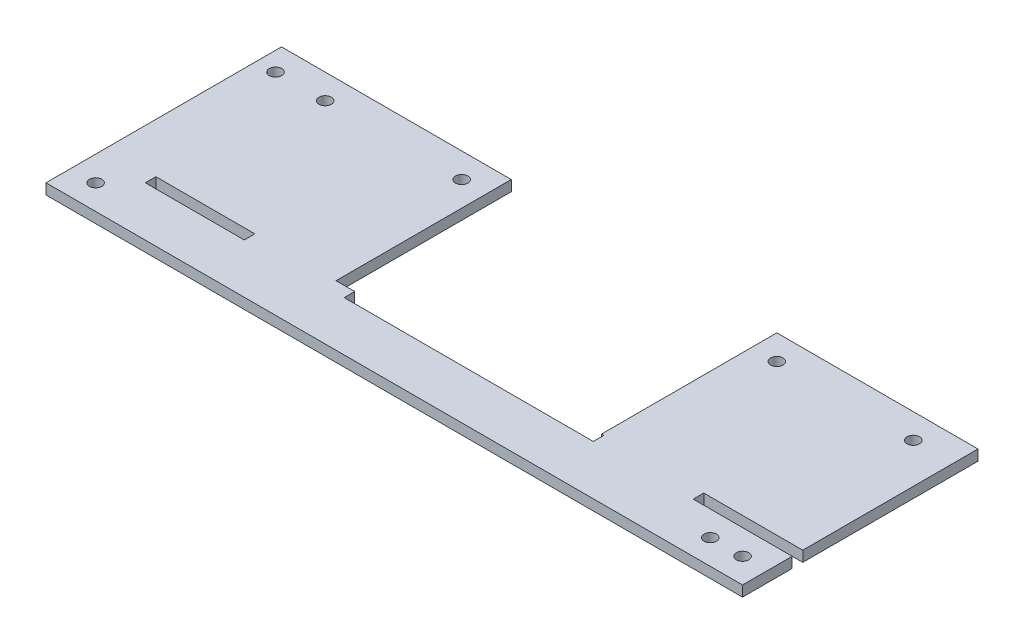
ISO-10303-21;
HEADER;
FILE_DESCRIPTION(('STEP AP214'),'2;1');
FILE_NAME('part.step','',(''),(''),'','','');
FILE_SCHEMA(('AUTOMOTIVE_DESIGN { 1 0 10303 214 1 1 1 1 }'));
ENDSEC;
DATA;
#1=APPLICATION_CONTEXT('core data for automotive mechanical design processes');
#2=APPLICATION_PROTOCOL_DEFINITION('international standard','automotive_design',2000,#1);
#3=PRODUCT_CONTEXT('',#1,'mechanical');
#4=PRODUCT('Part','Part','',(#3));
#5=PRODUCT_RELATED_PRODUCT_CATEGORY('part','',(#4));
#6=PRODUCT_DEFINITION_FORMATION('','',#4);
#7=PRODUCT_DEFINITION_CONTEXT('part definition',#1,'design');
#8=PRODUCT_DEFINITION('design','',#6,#7);
#9=PRODUCT_DEFINITION_SHAPE('','',#8);
#10=(LENGTH_UNIT() NAMED_UNIT(*) SI_UNIT(.MILLI.,.METRE.));
#11=(NAMED_UNIT(*) PLANE_ANGLE_UNIT() SI_UNIT($,.RADIAN.));
#12=(NAMED_UNIT(*) SI_UNIT($,.STERADIAN.) SOLID_ANGLE_UNIT());
#13=UNCERTAINTY_MEASURE_WITH_UNIT(LENGTH_MEASURE(1.E-05),#10,'distance_accuracy_value','');
#14=(GEOMETRIC_REPRESENTATION_CONTEXT(3) GLOBAL_UNCERTAINTY_ASSIGNED_CONTEXT((#13)) GLOBAL_UNIT_ASSIGNED_CONTEXT((#10,
#11,#12)) REPRESENTATION_CONTEXT('',''));
#15=CARTESIAN_POINT('',(0.,0.,0.));
#16=DIRECTION('',(0.,0.,1.));
#17=DIRECTION('',(1.,0.,0.));
#18=AXIS2_PLACEMENT_3D('',#15,#16,#17);
#19=CARTESIAN_POINT('',(75.2475,5.4102,-34.8361));
#20=DIRECTION('',(0.,-1.,0.));
#21=DIRECTION('',(0.,0.,-1.));
#22=AXIS2_PLACEMENT_3D('',#19,#20,#21);
#23=CYLINDRICAL_SURFACE('',#22,3.175);
#24=CARTESIAN_POINT('',(75.2475,5.4102,-34.8361));
#25=DIRECTION('',(0.,1.,0.));
#26=DIRECTION('',(0.,0.,1.));
#27=AXIS2_PLACEMENT_3D('',#24,#25,#26);
#28=CIRCLE('',#27,3.175);
#29=CARTESIAN_POINT('',(75.2475,5.4102,-31.6611));
#30=VERTEX_POINT('',#29);
#31=EDGE_CURVE('E265',#30,#30,#28,.T.);
#32=ORIENTED_EDGE('',*,*,#31,.T.);
#33=EDGE_LOOP('',(#32));
#34=FACE_BOUND('',#33,.T.);
#35=CARTESIAN_POINT('',(75.2475,0.,-34.8361));
#36=DIRECTION('',(0.,1.,0.));
#37=DIRECTION('',(0.,0.,1.));
#38=AXIS2_PLACEMENT_3D('',#35,#36,#37);
#39=CIRCLE('',#38,3.175);
#40=CARTESIAN_POINT('',(75.2475,0.,-31.6611));
#41=VERTEX_POINT('',#40);
#42=EDGE_CURVE('E300',#41,#41,#39,.T.);
#43=ORIENTED_EDGE('',*,*,#42,.F.);
#44=EDGE_LOOP('',(#43));
#45=FACE_BOUND('',#44,.T.);
#46=ADVANCED_FACE('F94',(#34,#45),#23,.F.);
#47=CARTESIAN_POINT('',(145.06956,5.4102,-34.8361));
#48=DIRECTION('',(0.,-1.,0.));
#49=DIRECTION('',(0.,0.,-1.));
#50=AXIS2_PLACEMENT_3D('',#47,#48,#49);
#51=CYLINDRICAL_SURFACE('',#50,3.17499999999997);
#52=CARTESIAN_POINT('',(145.06956,5.4102,-34.8361));
#53=DIRECTION('',(0.,1.,0.));
#54=DIRECTION('',(0.,0.,1.));
#55=AXIS2_PLACEMENT_3D('',#52,#53,#54);
#56=CIRCLE('',#55,3.17499999999997);
#57=CARTESIAN_POINT('',(145.06956,5.4102,-31.6611));
#58=VERTEX_POINT('',#57);
#59=EDGE_CURVE('E378',#58,#58,#56,.T.);
#60=ORIENTED_EDGE('',*,*,#59,.T.);
#61=EDGE_LOOP('',(#60));
#62=FACE_BOUND('',#61,.T.);
#63=CARTESIAN_POINT('',(145.06956,0.,-34.8361));
#64=DIRECTION('',(0.,1.,0.));
#65=DIRECTION('',(0.,0.,1.));
#66=AXIS2_PLACEMENT_3D('',#63,#64,#65);
#67=CIRCLE('',#66,3.17499999999997);
#68=CARTESIAN_POINT('',(145.06956,0.,-31.6611));
#69=VERTEX_POINT('',#68);
#70=EDGE_CURVE('E304',#69,#69,#67,.T.);
#71=ORIENTED_EDGE('',*,*,#70,.F.);
#72=EDGE_LOOP('',(#71));
#73=FACE_BOUND('',#72,.T.);
#74=ADVANCED_FACE('F474',(#62,#73),#51,.F.);
#75=CARTESIAN_POINT('',(-181.229,5.4102,-34.8361));
#76=DIRECTION('',(0.,-1.,0.));
#77=DIRECTION('',(0.,0.,-1.));
#78=AXIS2_PLACEMENT_3D('',#75,#76,#77);
#79=CYLINDRICAL_SURFACE('',#78,3.175);
#80=CARTESIAN_POINT('',(-181.229,5.4102,-34.8361));
#81=DIRECTION('',(0.,1.,0.));
#82=DIRECTION('',(0.,0.,1.));
#83=AXIS2_PLACEMENT_3D('',#80,#81,#82);
#84=CIRCLE('',#83,3.175);
#85=CARTESIAN_POINT('',(-181.229,5.4102,-31.6611));
#86=VERTEX_POINT('',#85);
#87=EDGE_CURVE('E381',#86,#86,#84,.T.);
#88=ORIENTED_EDGE('',*,*,#87,.T.);
#89=EDGE_LOOP('',(#88));
#90=FACE_BOUND('',#89,.T.);
#91=CARTESIAN_POINT('',(-181.229,0.,-34.8361));
#92=DIRECTION('',(0.,1.,0.));
#93=DIRECTION('',(0.,0.,1.));
#94=AXIS2_PLACEMENT_3D('',#91,#92,#93);
#95=CIRCLE('',#94,3.175);
#96=CARTESIAN_POINT('',(-181.229,0.,-31.6611));
#97=VERTEX_POINT('',#96);
#98=EDGE_CURVE('E307',#97,#97,#95,.T.);
#99=ORIENTED_EDGE('',*,*,#98,.F.);
#100=EDGE_LOOP('',(#99));
#101=FACE_BOUND('',#100,.T.);
#102=ADVANCED_FACE('F480',(#90,#101),#79,.F.);
#103=CARTESIAN_POINT('',(-178.181,5.4102,60.2361));
#104=DIRECTION('',(0.,-1.,0.));
#105=DIRECTION('',(0.,0.,-1.));
#106=AXIS2_PLACEMENT_3D('',#103,#104,#105);
#107=CYLINDRICAL_SURFACE('',#106,3.175);
#108=CARTESIAN_POINT('',(-178.181,5.4102,60.2361));
#109=DIRECTION('',(0.,1.,0.));
#110=DIRECTION('',(0.,0.,1.));
#111=AXIS2_PLACEMENT_3D('',#108,#109,#110);
#112=CIRCLE('',#111,3.175);
#113=CARTESIAN_POINT('',(-178.181,5.4102,63.4111));
#114=VERTEX_POINT('',#113);
#115=EDGE_CURVE('E384',#114,#114,#112,.T.);
#116=ORIENTED_EDGE('',*,*,#115,.T.);
#117=EDGE_LOOP('',(#116));
#118=FACE_BOUND('',#117,.T.);
#119=CARTESIAN_POINT('',(-178.181,0.,60.2361));
#120=DIRECTION('',(0.,1.,0.));
#121=DIRECTION('',(0.,0.,1.));
#122=AXIS2_PLACEMENT_3D('',#119,#120,#121);
#123=CIRCLE('',#122,3.175);
#124=CARTESIAN_POINT('',(-178.181,0.,63.4111));
#125=VERTEX_POINT('',#124);
#126=EDGE_CURVE('E310',#125,#125,#123,.T.);
#127=ORIENTED_EDGE('',*,*,#126,.F.);
#128=EDGE_LOOP('',(#127));
#129=FACE_BOUND('',#128,.T.);
#130=ADVANCED_FACE('F489',(#118,#129),#107,.F.);
#131=CARTESIAN_POINT('',(152.781,5.4102,60.2361));
#132=DIRECTION('',(0.,-1.,0.));
#133=DIRECTION('',(0.,0.,-1.));
#134=AXIS2_PLACEMENT_3D('',#131,#132,#133);
#135=CYLINDRICAL_SURFACE('',#134,3.175);
#136=CARTESIAN_POINT('',(152.781,5.4102,60.2361));
#137=DIRECTION('',(0.,1.,0.));
#138=DIRECTION('',(0.,0.,1.));
#139=AXIS2_PLACEMENT_3D('',#136,#137,#138);
#140=CIRCLE('',#139,3.175);
#141=CARTESIAN_POINT('',(152.781,5.4102,63.4111));
#142=VERTEX_POINT('',#141);
#143=EDGE_CURVE('E387',#142,#142,#140,.T.);
#144=ORIENTED_EDGE('',*,*,#143,.T.);
#145=EDGE_LOOP('',(#144));
#146=FACE_BOUND('',#145,.T.);
#147=CARTESIAN_POINT('',(152.781,0.,60.2361));
#148=DIRECTION('',(0.,1.,0.));
#149=DIRECTION('',(0.,0.,1.));
#150=AXIS2_PLACEMENT_3D('',#147,#148,#149);
#151=CIRCLE('',#150,3.175);
#152=CARTESIAN_POINT('',(152.781,0.,63.4111));
#153=VERTEX_POINT('',#152);
#154=EDGE_CURVE('E313',#153,#153,#151,.T.);
#155=ORIENTED_EDGE('',*,*,#154,.F.);
#156=EDGE_LOOP('',(#155));
#157=FACE_BOUND('',#156,.T.);
#158=ADVANCED_FACE('F493',(#146,#157),#135,.F.);
#159=CARTESIAN_POINT('',(136.271,5.4102,60.2361));
#160=DIRECTION('',(0.,-1.,0.));
#161=DIRECTION('',(0.,0.,-1.));
#162=AXIS2_PLACEMENT_3D('',#159,#160,#161);
#163=CYLINDRICAL_SURFACE('',#162,3.175);
#164=CARTESIAN_POINT('',(136.271,5.4102,60.2361));
#165=DIRECTION('',(0.,1.,0.));
#166=DIRECTION('',(0.,0.,1.));
#167=AXIS2_PLACEMENT_3D('',#164,#165,#166);
#168=CIRCLE('',#167,3.175);
#169=CARTESIAN_POINT('',(136.271,5.4102,63.4111));
#170=VERTEX_POINT('',#169);
#171=EDGE_CURVE('E390',#170,#170,#168,.T.);
#172=ORIENTED_EDGE('',*,*,#171,.T.);
#173=EDGE_LOOP('',(#172));
#174=FACE_BOUND('',#173,.T.);
#175=CARTESIAN_POINT('',(136.271,0.,60.2361));
#176=DIRECTION('',(0.,1.,0.));
#177=DIRECTION('',(0.,0.,1.));
#178=AXIS2_PLACEMENT_3D('',#175,#176,#177);
#179=CIRCLE('',#178,3.175);
#180=CARTESIAN_POINT('',(136.271,0.,63.4111));
#181=VERTEX_POINT('',#180);
#182=EDGE_CURVE('E316',#181,#181,#179,.T.);
#183=ORIENTED_EDGE('',*,*,#182,.F.);
#184=EDGE_LOOP('',(#183));
#185=FACE_BOUND('',#184,.T.);
#186=ADVANCED_FACE('F497',(#174,#185),#163,.F.);
#187=CARTESIAN_POINT('',(-155.829,5.4102,-34.8361));
#188=DIRECTION('',(0.,-1.,0.));
#189=DIRECTION('',(0.,0.,-1.));
#190=AXIS2_PLACEMENT_3D('',#187,#188,#189);
#191=CYLINDRICAL_SURFACE('',#190,3.175);
#192=CARTESIAN_POINT('',(-155.829,5.4102,-34.8361));
#193=DIRECTION('',(0.,1.,0.));
#194=DIRECTION('',(0.,0.,1.));
#195=AXIS2_PLACEMENT_3D('',#192,#193,#194);
#196=CIRCLE('',#195,3.175);
#197=CARTESIAN_POINT('',(-155.829,5.4102,-31.6611));
#198=VERTEX_POINT('',#197);
#199=EDGE_CURVE('E393',#198,#198,#196,.T.);
#200=ORIENTED_EDGE('',*,*,#199,.T.);
#201=EDGE_LOOP('',(#200));
#202=FACE_BOUND('',#201,.T.);
#203=CARTESIAN_POINT('',(-155.829,0.,-34.8361));
#204=DIRECTION('',(0.,1.,0.));
#205=DIRECTION('',(0.,0.,1.));
#206=AXIS2_PLACEMENT_3D('',#203,#204,#205);
#207=CIRCLE('',#206,3.175);
#208=CARTESIAN_POINT('',(-155.829,0.,-31.6611));
#209=VERTEX_POINT('',#208);
#210=EDGE_CURVE('E319',#209,#209,#207,.T.);
#211=ORIENTED_EDGE('',*,*,#210,.F.);
#212=EDGE_LOOP('',(#211));
#213=FACE_BOUND('',#212,.T.);
#214=ADVANCED_FACE('F501',(#202,#213),#191,.F.);
#215=CARTESIAN_POINT('',(-86.0069399999999,5.4102,-34.8361));
#216=DIRECTION('',(0.,-1.,0.));
#217=DIRECTION('',(0.,0.,-1.));
#218=AXIS2_PLACEMENT_3D('',#215,#216,#217);
#219=CYLINDRICAL_SURFACE('',#218,3.175);
#220=CARTESIAN_POINT('',(-86.0069399999999,5.4102,-34.8361));
#221=DIRECTION('',(0.,1.,0.));
#222=DIRECTION('',(0.,0.,1.));
#223=AXIS2_PLACEMENT_3D('',#220,#221,#222);
#224=CIRCLE('',#223,3.175);
#225=CARTESIAN_POINT('',(-86.0069399999999,5.4102,-31.6611));
#226=VERTEX_POINT('',#225);
#227=EDGE_CURVE('E396',#226,#226,#224,.T.);
#228=ORIENTED_EDGE('',*,*,#227,.T.);
#229=EDGE_LOOP('',(#228));
#230=FACE_BOUND('',#229,.T.);
#231=CARTESIAN_POINT('',(-86.0069399999999,0.,-34.8361));
#232=DIRECTION('',(0.,1.,0.));
#233=DIRECTION('',(0.,0.,1.));
#234=AXIS2_PLACEMENT_3D('',#231,#232,#233);
#235=CIRCLE('',#234,3.175);
#236=CARTESIAN_POINT('',(-86.0069399999999,0.,-31.6611));
#237=VERTEX_POINT('',#236);
#238=EDGE_CURVE('E322',#237,#237,#235,.T.);
#239=ORIENTED_EDGE('',*,*,#238,.F.);
#240=EDGE_LOOP('',(#239));
#241=FACE_BOUND('',#240,.T.);
#242=ADVANCED_FACE('F504',(#230,#241),#219,.F.);
#243=CARTESIAN_POINT('',(-165.481,5.4102,0.));
#244=DIRECTION('',(-1.,0.,0.));
#245=DIRECTION('',(0.,0.,1.));
#246=AXIS2_PLACEMENT_3D('',#243,#244,#245);
#247=PLANE('',#246);
#248=DIRECTION('',(0.,0.,-1.));
#249=VECTOR('',#248,1.);
#250=CARTESIAN_POINT('',(-165.481,0.,0.));
#251=LINE('',#250,#249);
#252=CARTESIAN_POINT('',(-165.481,0.,47.5361));
#253=VERTEX_POINT('',#252);
#254=CARTESIAN_POINT('',(-165.481,0.,42.1259));
#255=VERTEX_POINT('',#254);
#256=EDGE_CURVE('E257',#253,#255,#251,.T.);
#257=ORIENTED_EDGE('',*,*,#256,.T.);
#258=DIRECTION('',(0.,-1.,0.));
#259=VECTOR('',#258,1.);
#260=CARTESIAN_POINT('',(-165.481,5.4102,42.1259));
#261=LINE('',#260,#259);
#262=CARTESIAN_POINT('',(-165.481,5.4102,42.1259));
#263=VERTEX_POINT('',#262);
#264=EDGE_CURVE('E104',#263,#255,#261,.T.);
#265=ORIENTED_EDGE('',*,*,#264,.F.);
#266=DIRECTION('',(0.,0.,-1.));
#267=VECTOR('',#266,1.);
#268=CARTESIAN_POINT('',(-165.481,5.4102,0.));
#269=LINE('',#268,#267);
#270=CARTESIAN_POINT('',(-165.481,5.4102,47.5361));
#271=VERTEX_POINT('',#270);
#272=EDGE_CURVE('E246',#271,#263,#269,.T.);
#273=ORIENTED_EDGE('',*,*,#272,.F.);
#274=DIRECTION('',(0.,-1.,0.));
#275=VECTOR('',#274,1.);
#276=CARTESIAN_POINT('',(-165.481,5.4102,47.5361));
#277=LINE('',#276,#275);
#278=EDGE_CURVE('E12',#271,#253,#277,.T.);
#279=ORIENTED_EDGE('',*,*,#278,.T.);
#280=EDGE_LOOP('',(#257,#265,#273,#279));
#281=FACE_BOUND('',#280,.T.);
#282=ADVANCED_FACE('F255',(#281),#247,.F.);
#283=CARTESIAN_POINT('',(0.,5.4102,42.1259));
#284=DIRECTION('',(0.,0.,-1.));
#285=DIRECTION('',(-1.,0.,0.));
#286=AXIS2_PLACEMENT_3D('',#283,#284,#285);
#287=PLANE('',#286);
#288=DIRECTION('',(1.,0.,0.));
#289=VECTOR('',#288,1.);
#290=CARTESIAN_POINT('',(0.,0.,42.1259));
#291=LINE('',#290,#289);
#292=CARTESIAN_POINT('',(-114.8334,0.,42.1259));
#293=VERTEX_POINT('',#292);
#294=EDGE_CURVE('E328',#255,#293,#291,.T.);
#295=ORIENTED_EDGE('',*,*,#294,.T.);
#296=DIRECTION('',(0.,-1.,0.));
#297=VECTOR('',#296,1.);
#298=CARTESIAN_POINT('',(-114.8334,5.4102,42.1259));
#299=LINE('',#298,#297);
#300=CARTESIAN_POINT('',(-114.8334,5.4102,42.1259));
#301=VERTEX_POINT('',#300);
#302=EDGE_CURVE('E175',#301,#293,#299,.T.);
#303=ORIENTED_EDGE('',*,*,#302,.F.);
#304=DIRECTION('',(1.,0.,0.));
#305=VECTOR('',#304,1.);
#306=CARTESIAN_POINT('',(0.,5.4102,42.1259));
#307=LINE('',#306,#305);
#308=EDGE_CURVE('E238',#263,#301,#307,.T.);
#309=ORIENTED_EDGE('',*,*,#308,.F.);
#310=ORIENTED_EDGE('',*,*,#264,.T.);
#311=EDGE_LOOP('',(#295,#303,#309,#310));
#312=FACE_BOUND('',#311,.T.);
#313=ADVANCED_FACE('F240',(#312),#287,.F.);
#314=CARTESIAN_POINT('',(-114.8334,5.4102,0.));
#315=DIRECTION('',(-1.,0.,0.));
#316=DIRECTION('',(0.,0.,1.));
#317=AXIS2_PLACEMENT_3D('',#314,#315,#316);
#318=PLANE('',#317);
#319=DIRECTION('',(0.,0.,-1.));
#320=VECTOR('',#319,1.);
#321=CARTESIAN_POINT('',(-114.8334,0.,0.));
#322=LINE('',#321,#320);
#323=CARTESIAN_POINT('',(-114.8334,0.,47.5361));
#324=VERTEX_POINT('',#323);
#325=EDGE_CURVE('E325',#324,#293,#322,.T.);
#326=ORIENTED_EDGE('',*,*,#325,.F.);
#327=DIRECTION('',(0.,-1.,0.));
#328=VECTOR('',#327,1.);
#329=CARTESIAN_POINT('',(-114.8334,5.4102,47.5361));
#330=LINE('',#329,#328);
#331=CARTESIAN_POINT('',(-114.8334,5.4102,47.5361));
#332=VERTEX_POINT('',#331);
#333=EDGE_CURVE('E113',#332,#324,#330,.T.);
#334=ORIENTED_EDGE('',*,*,#333,.F.);
#335=DIRECTION('',(0.,0.,-1.));
#336=VECTOR('',#335,1.);
#337=CARTESIAN_POINT('',(-114.8334,5.4102,0.));
#338=LINE('',#337,#336);
#339=EDGE_CURVE('E245',#332,#301,#338,.T.);
#340=ORIENTED_EDGE('',*,*,#339,.T.);
#341=ORIENTED_EDGE('',*,*,#302,.T.);
#342=EDGE_LOOP('',(#326,#334,#340,#341));
#343=FACE_BOUND('',#342,.T.);
#344=ADVANCED_FACE('F461',(#343),#318,.T.);
#345=CARTESIAN_POINT('',(0.,5.4102,47.5361));
#346=DIRECTION('',(0.,0.,-1.));
#347=DIRECTION('',(-1.,0.,0.));
#348=AXIS2_PLACEMENT_3D('',#345,#346,#347);
#349=PLANE('',#348);
#350=DIRECTION('',(1.,0.,0.));
#351=VECTOR('',#350,1.);
#352=CARTESIAN_POINT('',(0.,0.,47.5361));
#353=LINE('',#352,#351);
#354=EDGE_CURVE('E331',#253,#324,#353,.T.);
#355=ORIENTED_EDGE('',*,*,#354,.F.);
#356=ORIENTED_EDGE('',*,*,#278,.F.);
#357=DIRECTION('',(1.,0.,0.));
#358=VECTOR('',#357,1.);
#359=CARTESIAN_POINT('',(0.,5.4102,47.5361));
#360=LINE('',#359,#358);
#361=EDGE_CURVE('E252',#271,#332,#360,.T.);
#362=ORIENTED_EDGE('',*,*,#361,.T.);
#363=ORIENTED_EDGE('',*,*,#333,.T.);
#364=EDGE_LOOP('',(#355,#356,#362,#363));
#365=FACE_BOUND('',#364,.T.);
#366=ADVANCED_FACE('F463',(#365),#349,.T.);
#367=CARTESIAN_POINT('',(114.8334,5.4102,0.));
#368=DIRECTION('',(-1.,0.,0.));
#369=DIRECTION('',(0.,0.,1.));
#370=AXIS2_PLACEMENT_3D('',#367,#368,#369);
#371=PLANE('',#370);
#372=DIRECTION('',(0.,0.,-1.));
#373=VECTOR('',#372,1.);
#374=CARTESIAN_POINT('',(114.8334,0.,0.));
#375=LINE('',#374,#373);
#376=CARTESIAN_POINT('',(114.8334,0.,47.5361));
#377=VERTEX_POINT('',#376);
#378=CARTESIAN_POINT('',(114.8334,0.,42.1259));
#379=VERTEX_POINT('',#378);
#380=EDGE_CURVE('E371',#377,#379,#375,.T.);
#381=ORIENTED_EDGE('',*,*,#380,.T.);
#382=DIRECTION('',(0.,-1.,0.));
#383=VECTOR('',#382,1.);
#384=CARTESIAN_POINT('',(114.8334,5.4102,42.1259));
#385=LINE('',#384,#383);
#386=CARTESIAN_POINT('',(114.8334,5.4102,42.1259));
#387=VERTEX_POINT('',#386);
#388=EDGE_CURVE('E291',#387,#379,#385,.T.);
#389=ORIENTED_EDGE('',*,*,#388,.F.);
#390=DIRECTION('',(0.,0.,-1.));
#391=VECTOR('',#390,1.);
#392=CARTESIAN_POINT('',(114.8334,5.4102,0.));
#393=LINE('',#392,#391);
#394=CARTESIAN_POINT('',(114.8334,5.4102,47.5361));
#395=VERTEX_POINT('',#394);
#396=EDGE_CURVE('E434',#395,#387,#393,.T.);
#397=ORIENTED_EDGE('',*,*,#396,.F.);
#398=DIRECTION('',(0.,-1.,0.));
#399=VECTOR('',#398,1.);
#400=CARTESIAN_POINT('',(114.8334,5.4102,47.5361));
#401=LINE('',#400,#399);
#402=EDGE_CURVE('E98',#395,#377,#401,.T.);
#403=ORIENTED_EDGE('',*,*,#402,.T.);
#404=EDGE_LOOP('',(#381,#389,#397,#403));
#405=FACE_BOUND('',#404,.T.);
#406=ADVANCED_FACE('F96',(#405),#371,.F.);
#407=CARTESIAN_POINT('',(0.,5.4102,42.1259));
#408=DIRECTION('',(0.,0.,1.));
#409=DIRECTION('',(1.,0.,0.));
#410=AXIS2_PLACEMENT_3D('',#407,#408,#409);
#411=PLANE('',#410);
#412=DIRECTION('',(-1.,0.,0.));
#413=VECTOR('',#412,1.);
#414=CARTESIAN_POINT('',(0.,0.,42.1259));
#415=LINE('',#414,#413);
#416=CARTESIAN_POINT('',(165.481,0.,42.1259));
#417=VERTEX_POINT('',#416);
#418=EDGE_CURVE('E368',#417,#379,#415,.T.);
#419=ORIENTED_EDGE('',*,*,#418,.F.);
#420=DIRECTION('',(0.,-1.,0.));
#421=VECTOR('',#420,1.);
#422=CARTESIAN_POINT('',(165.481,5.4102,42.1259));
#423=LINE('',#422,#421);
#424=CARTESIAN_POINT('',(165.481,5.4102,42.1259));
#425=VERTEX_POINT('',#424);
#426=EDGE_CURVE('E290',#425,#417,#423,.T.);
#427=ORIENTED_EDGE('',*,*,#426,.F.);
#428=DIRECTION('',(-1.,0.,0.));
#429=VECTOR('',#428,1.);
#430=CARTESIAN_POINT('',(0.,5.4102,42.1259));
#431=LINE('',#430,#429);
#432=EDGE_CURVE('E432',#425,#387,#431,.T.);
#433=ORIENTED_EDGE('',*,*,#432,.T.);
#434=ORIENTED_EDGE('',*,*,#388,.T.);
#435=EDGE_LOOP('',(#419,#427,#433,#434));
#436=FACE_BOUND('',#435,.T.);
#437=ADVANCED_FACE('F575',(#436),#411,.T.);
#438=CARTESIAN_POINT('',(165.481,5.4102,0.));
#439=DIRECTION('',(-1.,0.,0.));
#440=DIRECTION('',(0.,0.,1.));
#441=AXIS2_PLACEMENT_3D('',#438,#439,#440);
#442=PLANE('',#441);
#443=DIRECTION('',(0.,0.,-1.));
#444=VECTOR('',#443,1.);
#445=CARTESIAN_POINT('',(165.481,0.,0.));
#446=LINE('',#445,#444);
#447=CARTESIAN_POINT('',(165.481,0.,-47.5361));
#448=VERTEX_POINT('',#447);
#449=EDGE_CURVE('E365',#417,#448,#446,.T.);
#450=ORIENTED_EDGE('',*,*,#449,.T.);
#451=DIRECTION('',(0.,-1.,0.));
#452=VECTOR('',#451,1.);
#453=CARTESIAN_POINT('',(165.481,5.4102,-47.5361));
#454=LINE('',#453,#452);
#455=CARTESIAN_POINT('',(165.481,5.4102,-47.5361));
#456=VERTEX_POINT('',#455);
#457=EDGE_CURVE('E288',#456,#448,#454,.T.);
#458=ORIENTED_EDGE('',*,*,#457,.F.);
#459=DIRECTION('',(0.,0.,-1.));
#460=VECTOR('',#459,1.);
#461=CARTESIAN_POINT('',(165.481,5.4102,0.));
#462=LINE('',#461,#460);
#463=EDGE_CURVE('E430',#425,#456,#462,.T.);
#464=ORIENTED_EDGE('',*,*,#463,.F.);
#465=ORIENTED_EDGE('',*,*,#426,.T.);
#466=EDGE_LOOP('',(#450,#458,#464,#465));
#467=FACE_BOUND('',#466,.T.);
#468=ADVANCED_FACE('F572',(#467),#442,.F.);
#469=CARTESIAN_POINT('',(0.,5.4102,-47.5361));
#470=DIRECTION('',(0.,0.,-1.));
#471=DIRECTION('',(-1.,0.,0.));
#472=AXIS2_PLACEMENT_3D('',#469,#470,#471);
#473=PLANE('',#472);
#474=DIRECTION('',(1.,0.,0.));
#475=VECTOR('',#474,1.);
#476=CARTESIAN_POINT('',(0.,0.,-47.5361));
#477=LINE('',#476,#475);
#478=CARTESIAN_POINT('',(62.5475,0.,-47.5361));
#479=VERTEX_POINT('',#478);
#480=EDGE_CURVE('E362',#479,#448,#477,.T.);
#481=ORIENTED_EDGE('',*,*,#480,.F.);
#482=DIRECTION('',(0.,-1.,0.));
#483=VECTOR('',#482,1.);
#484=CARTESIAN_POINT('',(62.5475,5.4102,-47.5361));
#485=LINE('',#484,#483);
#486=CARTESIAN_POINT('',(62.5475,5.4102,-47.5361));
#487=VERTEX_POINT('',#486);
#488=EDGE_CURVE('E286',#487,#479,#485,.T.);
#489=ORIENTED_EDGE('',*,*,#488,.F.);
#490=DIRECTION('',(1.,0.,0.));
#491=VECTOR('',#490,1.);
#492=CARTESIAN_POINT('',(0.,5.4102,-47.5361));
#493=LINE('',#492,#491);
#494=EDGE_CURVE('E427',#487,#456,#493,.T.);
#495=ORIENTED_EDGE('',*,*,#494,.T.);
#496=ORIENTED_EDGE('',*,*,#457,.T.);
#497=EDGE_LOOP('',(#481,#489,#495,#496));
#498=FACE_BOUND('',#497,.T.);
#499=ADVANCED_FACE('F568',(#498),#473,.T.);
#500=CARTESIAN_POINT('',(62.5475,5.4102,0.));
#501=DIRECTION('',(-1.,0.,0.));
#502=DIRECTION('',(0.,0.,1.));
#503=AXIS2_PLACEMENT_3D('',#500,#501,#502);
#504=PLANE('',#503);
#505=DIRECTION('',(0.,0.,-1.));
#506=VECTOR('',#505,1.);
#507=CARTESIAN_POINT('',(62.5475,0.,0.));
#508=LINE('',#507,#506);
#509=CARTESIAN_POINT('',(62.5475,0.,42.1259));
#510=VERTEX_POINT('',#509);
#511=EDGE_CURVE('E359',#510,#479,#508,.T.);
#512=ORIENTED_EDGE('',*,*,#511,.F.);
#513=DIRECTION('',(0.,-1.,0.));
#514=VECTOR('',#513,1.);
#515=CARTESIAN_POINT('',(62.5475,5.4102,42.1259));
#516=LINE('',#515,#514);
#517=CARTESIAN_POINT('',(62.5475,5.4102,42.1259));
#518=VERTEX_POINT('',#517);
#519=EDGE_CURVE('E284',#518,#510,#516,.T.);
#520=ORIENTED_EDGE('',*,*,#519,.F.);
#521=DIRECTION('',(0.,0.,-1.));
#522=VECTOR('',#521,1.);
#523=CARTESIAN_POINT('',(62.5475,5.4102,0.));
#524=LINE('',#523,#522);
#525=EDGE_CURVE('E424',#518,#487,#524,.T.);
#526=ORIENTED_EDGE('',*,*,#525,.T.);
#527=ORIENTED_EDGE('',*,*,#488,.T.);
#528=EDGE_LOOP('',(#512,#520,#526,#527));
#529=FACE_BOUND('',#528,.T.);
#530=ADVANCED_FACE('F561',(#529),#504,.T.);
#531=CARTESIAN_POINT('',(0.,5.4102,42.1259));
#532=DIRECTION('',(0.,0.,-1.));
#533=DIRECTION('',(-1.,0.,0.));
#534=AXIS2_PLACEMENT_3D('',#531,#532,#533);
#535=PLANE('',#534);
#536=DIRECTION('',(1.,0.,0.));
#537=VECTOR('',#536,1.);
#538=CARTESIAN_POINT('',(0.,0.,42.1259));
#539=LINE('',#538,#537);
#540=CARTESIAN_POINT('',(63.7286,0.,42.1259));
#541=VERTEX_POINT('',#540);
#542=EDGE_CURVE('E356',#510,#541,#539,.T.);
#543=ORIENTED_EDGE('',*,*,#542,.T.);
#544=DIRECTION('',(0.,-1.,0.));
#545=VECTOR('',#544,1.);
#546=CARTESIAN_POINT('',(63.7286,5.4102,42.1259));
#547=LINE('',#546,#545);
#548=CARTESIAN_POINT('',(63.7286,5.4102,42.1259));
#549=VERTEX_POINT('',#548);
#550=EDGE_CURVE('E282',#549,#541,#547,.T.);
#551=ORIENTED_EDGE('',*,*,#550,.F.);
#552=DIRECTION('',(1.,0.,0.));
#553=VECTOR('',#552,1.);
#554=CARTESIAN_POINT('',(0.,5.4102,42.1259));
#555=LINE('',#554,#553);
#556=EDGE_CURVE('E422',#518,#549,#555,.T.);
#557=ORIENTED_EDGE('',*,*,#556,.F.);
#558=ORIENTED_EDGE('',*,*,#519,.T.);
#559=EDGE_LOOP('',(#543,#551,#557,#558));
#560=FACE_BOUND('',#559,.T.);
#561=ADVANCED_FACE('F556',(#560),#535,.F.);
#562=CARTESIAN_POINT('',(63.7286,5.4102,0.));
#563=DIRECTION('',(-1.,0.,0.));
#564=DIRECTION('',(0.,0.,1.));
#565=AXIS2_PLACEMENT_3D('',#562,#563,#564);
#566=PLANE('',#565);
#567=DIRECTION('',(0.,0.,-1.));
#568=VECTOR('',#567,1.);
#569=CARTESIAN_POINT('',(63.7286,0.,0.));
#570=LINE('',#569,#568);
#571=CARTESIAN_POINT('',(63.7286,0.,47.5361));
#572=VERTEX_POINT('',#571);
#573=EDGE_CURVE('E353',#572,#541,#570,.T.);
#574=ORIENTED_EDGE('',*,*,#573,.F.);
#575=DIRECTION('',(0.,-1.,0.));
#576=VECTOR('',#575,1.);
#577=CARTESIAN_POINT('',(63.7286,5.4102,47.5361));
#578=LINE('',#577,#576);
#579=CARTESIAN_POINT('',(63.7286,5.4102,47.5361));
#580=VERTEX_POINT('',#579);
#581=EDGE_CURVE('E280',#580,#572,#578,.T.);
#582=ORIENTED_EDGE('',*,*,#581,.F.);
#583=DIRECTION('',(0.,0.,-1.));
#584=VECTOR('',#583,1.);
#585=CARTESIAN_POINT('',(63.7286,5.4102,0.));
#586=LINE('',#585,#584);
#587=EDGE_CURVE('E419',#580,#549,#586,.T.);
#588=ORIENTED_EDGE('',*,*,#587,.T.);
#589=ORIENTED_EDGE('',*,*,#550,.T.);
#590=EDGE_LOOP('',(#574,#582,#588,#589));
#591=FACE_BOUND('',#590,.T.);
#592=ADVANCED_FACE('F453',(#591),#566,.T.);
#593=CARTESIAN_POINT('',(-63.7285999999999,0.,47.5361));
#594=VERTEX_POINT('',#593);
#595=EDGE_CURVE('E352',#594,#572,#353,.T.);
#596=ORIENTED_EDGE('',*,*,#595,.F.);
#597=DIRECTION('',(0.,-1.,0.));
#598=VECTOR('',#597,1.);
#599=CARTESIAN_POINT('',(-63.7285999999999,5.4102,47.5361));
#600=LINE('',#599,#598);
#601=CARTESIAN_POINT('',(-63.7285999999999,5.4102,47.5361));
#602=VERTEX_POINT('',#601);
#603=EDGE_CURVE('E278',#602,#594,#600,.T.);
#604=ORIENTED_EDGE('',*,*,#603,.F.);
#605=EDGE_CURVE('E418',#602,#580,#360,.T.);
#606=ORIENTED_EDGE('',*,*,#605,.T.);
#607=ORIENTED_EDGE('',*,*,#581,.T.);
#608=EDGE_LOOP('',(#596,#604,#606,#607));
#609=FACE_BOUND('',#608,.T.);
#610=ADVANCED_FACE('F442',(#609),#349,.T.);
#611=CARTESIAN_POINT('',(-63.7285999999999,5.4102,0.));
#612=DIRECTION('',(-1.,0.,0.));
#613=DIRECTION('',(0.,0.,1.));
#614=AXIS2_PLACEMENT_3D('',#611,#612,#613);
#615=PLANE('',#614);
#616=DIRECTION('',(0.,0.,-1.));
#617=VECTOR('',#616,1.);
#618=CARTESIAN_POINT('',(-63.7285999999999,0.,0.));
#619=LINE('',#618,#617);
#620=CARTESIAN_POINT('',(-63.7285999999999,0.,42.1259));
#621=VERTEX_POINT('',#620);
#622=EDGE_CURVE('E349',#594,#621,#619,.T.);
#623=ORIENTED_EDGE('',*,*,#622,.T.);
#624=DIRECTION('',(0.,-1.,0.));
#625=VECTOR('',#624,1.);
#626=CARTESIAN_POINT('',(-63.7285999999999,5.4102,42.1259));
#627=LINE('',#626,#625);
#628=CARTESIAN_POINT('',(-63.7285999999999,5.4102,42.1259));
#629=VERTEX_POINT('',#628);
#630=EDGE_CURVE('E276',#629,#621,#627,.T.);
#631=ORIENTED_EDGE('',*,*,#630,.F.);
#632=DIRECTION('',(0.,0.,-1.));
#633=VECTOR('',#632,1.);
#634=CARTESIAN_POINT('',(-63.7285999999999,5.4102,0.));
#635=LINE('',#634,#633);
#636=EDGE_CURVE('E416',#602,#629,#635,.T.);
#637=ORIENTED_EDGE('',*,*,#636,.F.);
#638=ORIENTED_EDGE('',*,*,#603,.T.);
#639=EDGE_LOOP('',(#623,#631,#637,#638));
#640=FACE_BOUND('',#639,.T.);
#641=ADVANCED_FACE('F548',(#640),#615,.F.);
#642=CARTESIAN_POINT('',(0.,5.4102,42.1259));
#643=DIRECTION('',(0.,0.,-1.));
#644=DIRECTION('',(-1.,0.,0.));
#645=AXIS2_PLACEMENT_3D('',#642,#643,#644);
#646=PLANE('',#645);
#647=DIRECTION('',(1.,0.,0.));
#648=VECTOR('',#647,1.);
#649=CARTESIAN_POINT('',(0.,0.,42.1259));
#650=LINE('',#649,#648);
#651=CARTESIAN_POINT('',(-73.3069399999999,0.,42.1259));
#652=VERTEX_POINT('',#651);
#653=EDGE_CURVE('E346',#652,#621,#650,.T.);
#654=ORIENTED_EDGE('',*,*,#653,.F.);
#655=DIRECTION('',(0.,-1.,0.));
#656=VECTOR('',#655,1.);
#657=CARTESIAN_POINT('',(-73.3069399999999,5.4102,42.1259));
#658=LINE('',#657,#656);
#659=CARTESIAN_POINT('',(-73.3069399999999,5.4102,42.1259));
#660=VERTEX_POINT('',#659);
#661=EDGE_CURVE('E274',#660,#652,#658,.T.);
#662=ORIENTED_EDGE('',*,*,#661,.F.);
#663=DIRECTION('',(1.,0.,0.));
#664=VECTOR('',#663,1.);
#665=CARTESIAN_POINT('',(0.,5.4102,42.1259));
#666=LINE('',#665,#664);
#667=EDGE_CURVE('E413',#660,#629,#666,.T.);
#668=ORIENTED_EDGE('',*,*,#667,.T.);
#669=ORIENTED_EDGE('',*,*,#630,.T.);
#670=EDGE_LOOP('',(#654,#662,#668,#669));
#671=FACE_BOUND('',#670,.T.);
#672=ADVANCED_FACE('F553',(#671),#646,.T.);
#673=CARTESIAN_POINT('',(-73.3069399999999,5.4102,0.));
#674=DIRECTION('',(1.,0.,0.));
#675=DIRECTION('',(0.,0.,-1.));
#676=AXIS2_PLACEMENT_3D('',#673,#674,#675);
#677=PLANE('',#676);
#678=DIRECTION('',(0.,0.,1.));
#679=VECTOR('',#678,1.);
#680=CARTESIAN_POINT('',(-73.3069399999999,0.,0.));
#681=LINE('',#680,#679);
#682=CARTESIAN_POINT('',(-73.30694,0.,-47.5361));
#683=VERTEX_POINT('',#682);
#684=EDGE_CURVE('E343',#683,#652,#681,.T.);
#685=ORIENTED_EDGE('',*,*,#684,.F.);
#686=DIRECTION('',(0.,-1.,0.));
#687=VECTOR('',#686,1.);
#688=CARTESIAN_POINT('',(-73.30694,5.4102,-47.5361));
#689=LINE('',#688,#687);
#690=CARTESIAN_POINT('',(-73.30694,5.4102,-47.5361));
#691=VERTEX_POINT('',#690);
#692=EDGE_CURVE('E272',#691,#683,#689,.T.);
#693=ORIENTED_EDGE('',*,*,#692,.F.);
#694=DIRECTION('',(0.,0.,1.));
#695=VECTOR('',#694,1.);
#696=CARTESIAN_POINT('',(-73.3069399999999,5.4102,0.));
#697=LINE('',#696,#695);
#698=EDGE_CURVE('E410',#691,#660,#697,.T.);
#699=ORIENTED_EDGE('',*,*,#698,.T.);
#700=ORIENTED_EDGE('',*,*,#661,.T.);
#701=EDGE_LOOP('',(#685,#693,#699,#700));
#702=FACE_BOUND('',#701,.T.);
#703=ADVANCED_FACE('F604',(#702),#677,.T.);
#704=CARTESIAN_POINT('',(0.,5.4102,-47.5361));
#705=DIRECTION('',(0.,0.,-1.));
#706=DIRECTION('',(-1.,0.,0.));
#707=AXIS2_PLACEMENT_3D('',#704,#705,#706);
#708=PLANE('',#707);
#709=DIRECTION('',(1.,0.,0.));
#710=VECTOR('',#709,1.);
#711=CARTESIAN_POINT('',(0.,0.,-47.5361));
#712=LINE('',#711,#710);
#713=CARTESIAN_POINT('',(-190.881,0.,-47.5361));
#714=VERTEX_POINT('',#713);
#715=EDGE_CURVE('E340',#714,#683,#712,.T.);
#716=ORIENTED_EDGE('',*,*,#715,.F.);
#717=DIRECTION('',(0.,-1.,0.));
#718=VECTOR('',#717,1.);
#719=CARTESIAN_POINT('',(-190.881,5.4102,-47.5361));
#720=LINE('',#719,#718);
#721=CARTESIAN_POINT('',(-190.881,5.4102,-47.5361));
#722=VERTEX_POINT('',#721);
#723=EDGE_CURVE('E270',#722,#714,#720,.T.);
#724=ORIENTED_EDGE('',*,*,#723,.F.);
#725=DIRECTION('',(1.,0.,0.));
#726=VECTOR('',#725,1.);
#727=CARTESIAN_POINT('',(0.,5.4102,-47.5361));
#728=LINE('',#727,#726);
#729=EDGE_CURVE('E407',#722,#691,#728,.T.);
#730=ORIENTED_EDGE('',*,*,#729,.T.);
#731=ORIENTED_EDGE('',*,*,#692,.T.);
#732=EDGE_LOOP('',(#716,#724,#730,#731));
#733=FACE_BOUND('',#732,.T.);
#734=ADVANCED_FACE('F600',(#733),#708,.T.);
#735=CARTESIAN_POINT('',(-190.881,5.4102,0.));
#736=DIRECTION('',(1.,0.,0.));
#737=DIRECTION('',(0.,0.,-1.));
#738=AXIS2_PLACEMENT_3D('',#735,#736,#737);
#739=PLANE('',#738);
#740=DIRECTION('',(0.,0.,1.));
#741=VECTOR('',#740,1.);
#742=CARTESIAN_POINT('',(-190.881,0.,0.));
#743=LINE('',#742,#741);
#744=CARTESIAN_POINT('',(-190.881,0.,72.9361));
#745=VERTEX_POINT('',#744);
#746=EDGE_CURVE('E338',#714,#745,#743,.T.);
#747=ORIENTED_EDGE('',*,*,#746,.T.);
#748=DIRECTION('',(0.,-1.,0.));
#749=VECTOR('',#748,1.);
#750=CARTESIAN_POINT('',(-190.881,5.4102,72.9361));
#751=LINE('',#750,#749);
#752=CARTESIAN_POINT('',(-190.881,5.4102,72.9361));
#753=VERTEX_POINT('',#752);
#754=EDGE_CURVE('E267',#753,#745,#751,.T.);
#755=ORIENTED_EDGE('',*,*,#754,.F.);
#756=DIRECTION('',(0.,0.,1.));
#757=VECTOR('',#756,1.);
#758=CARTESIAN_POINT('',(-190.881,5.4102,0.));
#759=LINE('',#758,#757);
#760=EDGE_CURVE('E405',#722,#753,#759,.T.);
#761=ORIENTED_EDGE('',*,*,#760,.F.);
#762=ORIENTED_EDGE('',*,*,#723,.T.);
#763=EDGE_LOOP('',(#747,#755,#761,#762));
#764=FACE_BOUND('',#763,.T.);
#765=ADVANCED_FACE('F597',(#764),#739,.F.);
#766=CARTESIAN_POINT('',(0.,5.4102,72.9361));
#767=DIRECTION('',(0.,0.,-1.));
#768=DIRECTION('',(-1.,0.,0.));
#769=AXIS2_PLACEMENT_3D('',#766,#767,#768);
#770=PLANE('',#769);
#771=DIRECTION('',(1.,0.,0.));
#772=VECTOR('',#771,1.);
#773=CARTESIAN_POINT('',(0.,0.,72.9361));
#774=LINE('',#773,#772);
#775=CARTESIAN_POINT('',(165.481,0.,72.9361));
#776=VERTEX_POINT('',#775);
#777=EDGE_CURVE('E335',#745,#776,#774,.T.);
#778=ORIENTED_EDGE('',*,*,#777,.T.);
#779=DIRECTION('',(0.,-1.,0.));
#780=VECTOR('',#779,1.);
#781=CARTESIAN_POINT('',(165.481,5.4102,72.9361));
#782=LINE('',#781,#780);
#783=CARTESIAN_POINT('',(165.481,5.4102,72.9361));
#784=VERTEX_POINT('',#783);
#785=EDGE_CURVE('E264',#784,#776,#782,.T.);
#786=ORIENTED_EDGE('',*,*,#785,.F.);
#787=DIRECTION('',(1.,0.,0.));
#788=VECTOR('',#787,1.);
#789=CARTESIAN_POINT('',(0.,5.4102,72.9361));
#790=LINE('',#789,#788);
#791=EDGE_CURVE('E403',#753,#784,#790,.T.);
#792=ORIENTED_EDGE('',*,*,#791,.F.);
#793=ORIENTED_EDGE('',*,*,#754,.T.);
#794=EDGE_LOOP('',(#778,#786,#792,#793));
#795=FACE_BOUND('',#794,.T.);
#796=ADVANCED_FACE('F544',(#795),#770,.F.);
#797=CARTESIAN_POINT('',(165.481,5.4102,-1.80827575135822E-13));
#798=DIRECTION('',(1.,0.,0.));
#799=DIRECTION('',(0.,0.,-1.));
#800=AXIS2_PLACEMENT_3D('',#797,#798,#799);
#801=PLANE('',#800);
#802=DIRECTION('',(0.,0.,1.));
#803=VECTOR('',#802,1.);
#804=CARTESIAN_POINT('',(165.481,0.,-1.80827575135822E-13));
#805=LINE('',#804,#803);
#806=CARTESIAN_POINT('',(165.481,0.,47.5361));
#807=VERTEX_POINT('',#806);
#808=EDGE_CURVE('E332',#807,#776,#805,.T.);
#809=ORIENTED_EDGE('',*,*,#808,.F.);
#810=DIRECTION('',(0.,-1.,0.));
#811=VECTOR('',#810,1.);
#812=CARTESIAN_POINT('',(165.481,5.4102,47.5361));
#813=LINE('',#812,#811);
#814=CARTESIAN_POINT('',(165.481,5.4102,47.5361));
#815=VERTEX_POINT('',#814);
#816=EDGE_CURVE('E262',#815,#807,#813,.T.);
#817=ORIENTED_EDGE('',*,*,#816,.F.);
#818=DIRECTION('',(0.,0.,1.));
#819=VECTOR('',#818,1.);
#820=CARTESIAN_POINT('',(165.481,5.4102,-1.80827575135822E-13));
#821=LINE('',#820,#819);
#822=EDGE_CURVE('E400',#815,#784,#821,.T.);
#823=ORIENTED_EDGE('',*,*,#822,.T.);
#824=ORIENTED_EDGE('',*,*,#785,.T.);
#825=EDGE_LOOP('',(#809,#817,#823,#824));
#826=FACE_BOUND('',#825,.T.);
#827=ADVANCED_FACE('F540',(#826),#801,.T.);
#828=EDGE_CURVE('E373',#377,#807,#353,.T.);
#829=ORIENTED_EDGE('',*,*,#828,.F.);
#830=ORIENTED_EDGE('',*,*,#402,.F.);
#831=EDGE_CURVE('E303',#395,#815,#360,.T.);
#832=ORIENTED_EDGE('',*,*,#831,.T.);
#833=ORIENTED_EDGE('',*,*,#816,.T.);
#834=EDGE_LOOP('',(#829,#830,#832,#833));
#835=FACE_BOUND('',#834,.T.);
#836=ADVANCED_FACE('F470',(#835),#349,.T.);
#837=CARTESIAN_POINT('',(0.,0.,0.));
#838=DIRECTION('',(0.,1.,0.));
#839=DIRECTION('',(0.,0.,1.));
#840=AXIS2_PLACEMENT_3D('',#837,#838,#839);
#841=PLANE('',#840);
#842=ORIENTED_EDGE('',*,*,#828,.T.);
#843=ORIENTED_EDGE('',*,*,#808,.T.);
#844=ORIENTED_EDGE('',*,*,#777,.F.);
#845=ORIENTED_EDGE('',*,*,#746,.F.);
#846=ORIENTED_EDGE('',*,*,#715,.T.);
#847=ORIENTED_EDGE('',*,*,#684,.T.);
#848=ORIENTED_EDGE('',*,*,#653,.T.);
#849=ORIENTED_EDGE('',*,*,#622,.F.);
#850=ORIENTED_EDGE('',*,*,#595,.T.);
#851=ORIENTED_EDGE('',*,*,#573,.T.);
#852=ORIENTED_EDGE('',*,*,#542,.F.);
#853=ORIENTED_EDGE('',*,*,#511,.T.);
#854=ORIENTED_EDGE('',*,*,#480,.T.);
#855=ORIENTED_EDGE('',*,*,#449,.F.);
#856=ORIENTED_EDGE('',*,*,#418,.T.);
#857=ORIENTED_EDGE('',*,*,#380,.F.);
#858=EDGE_LOOP('',(#842,#843,#844,#845,#846,#847,#848,#849,#850,#851,#852,#853,#854,#855,#856,#857));
#859=FACE_BOUND('',#858,.T.);
#860=ORIENTED_EDGE('',*,*,#354,.T.);
#861=ORIENTED_EDGE('',*,*,#325,.T.);
#862=ORIENTED_EDGE('',*,*,#294,.F.);
#863=ORIENTED_EDGE('',*,*,#256,.F.);
#864=EDGE_LOOP('',(#860,#861,#862,#863));
#865=FACE_BOUND('',#864,.T.);
#866=ORIENTED_EDGE('',*,*,#238,.T.);
#867=EDGE_LOOP('',(#866));
#868=FACE_BOUND('',#867,.T.);
#869=ORIENTED_EDGE('',*,*,#210,.T.);
#870=EDGE_LOOP('',(#869));
#871=FACE_BOUND('',#870,.T.);
#872=ORIENTED_EDGE('',*,*,#182,.T.);
#873=EDGE_LOOP('',(#872));
#874=FACE_BOUND('',#873,.T.);
#875=ORIENTED_EDGE('',*,*,#154,.T.);
#876=EDGE_LOOP('',(#875));
#877=FACE_BOUND('',#876,.T.);
#878=ORIENTED_EDGE('',*,*,#126,.T.);
#879=EDGE_LOOP('',(#878));
#880=FACE_BOUND('',#879,.T.);
#881=ORIENTED_EDGE('',*,*,#98,.T.);
#882=EDGE_LOOP('',(#881));
#883=FACE_BOUND('',#882,.T.);
#884=ORIENTED_EDGE('',*,*,#70,.T.);
#885=EDGE_LOOP('',(#884));
#886=FACE_BOUND('',#885,.T.);
#887=ORIENTED_EDGE('',*,*,#42,.T.);
#888=EDGE_LOOP('',(#887));
#889=FACE_BOUND('',#888,.T.);
#890=ADVANCED_FACE('F458',(#859,#865,#868,#871,#874,#877,#880,#883,#886,#889),#841,.F.);
#891=CARTESIAN_POINT('',(0.,5.4102,0.));
#892=DIRECTION('',(0.,1.,0.));
#893=DIRECTION('',(0.,0.,1.));
#894=AXIS2_PLACEMENT_3D('',#891,#892,#893);
#895=PLANE('',#894);
#896=ORIENTED_EDGE('',*,*,#831,.F.);
#897=ORIENTED_EDGE('',*,*,#396,.T.);
#898=ORIENTED_EDGE('',*,*,#432,.F.);
#899=ORIENTED_EDGE('',*,*,#463,.T.);
#900=ORIENTED_EDGE('',*,*,#494,.F.);
#901=ORIENTED_EDGE('',*,*,#525,.F.);
#902=ORIENTED_EDGE('',*,*,#556,.T.);
#903=ORIENTED_EDGE('',*,*,#587,.F.);
#904=ORIENTED_EDGE('',*,*,#605,.F.);
#905=ORIENTED_EDGE('',*,*,#636,.T.);
#906=ORIENTED_EDGE('',*,*,#667,.F.);
#907=ORIENTED_EDGE('',*,*,#698,.F.);
#908=ORIENTED_EDGE('',*,*,#729,.F.);
#909=ORIENTED_EDGE('',*,*,#760,.T.);
#910=ORIENTED_EDGE('',*,*,#791,.T.);
#911=ORIENTED_EDGE('',*,*,#822,.F.);
#912=EDGE_LOOP('',(#896,#897,#898,#899,#900,#901,#902,#903,#904,#905,#906,#907,#908,#909,#910,#911));
#913=FACE_BOUND('',#912,.T.);
#914=ORIENTED_EDGE('',*,*,#361,.F.);
#915=ORIENTED_EDGE('',*,*,#272,.T.);
#916=ORIENTED_EDGE('',*,*,#308,.T.);
#917=ORIENTED_EDGE('',*,*,#339,.F.);
#918=EDGE_LOOP('',(#914,#915,#916,#917));
#919=FACE_BOUND('',#918,.T.);
#920=ORIENTED_EDGE('',*,*,#227,.F.);
#921=EDGE_LOOP('',(#920));
#922=FACE_BOUND('',#921,.T.);
#923=ORIENTED_EDGE('',*,*,#199,.F.);
#924=EDGE_LOOP('',(#923));
#925=FACE_BOUND('',#924,.T.);
#926=ORIENTED_EDGE('',*,*,#171,.F.);
#927=EDGE_LOOP('',(#926));
#928=FACE_BOUND('',#927,.T.);
#929=ORIENTED_EDGE('',*,*,#143,.F.);
#930=EDGE_LOOP('',(#929));
#931=FACE_BOUND('',#930,.T.);
#932=ORIENTED_EDGE('',*,*,#115,.F.);
#933=EDGE_LOOP('',(#932));
#934=FACE_BOUND('',#933,.T.);
#935=ORIENTED_EDGE('',*,*,#87,.F.);
#936=EDGE_LOOP('',(#935));
#937=FACE_BOUND('',#936,.T.);
#938=ORIENTED_EDGE('',*,*,#59,.F.);
#939=EDGE_LOOP('',(#938));
#940=FACE_BOUND('',#939,.T.);
#941=ORIENTED_EDGE('',*,*,#31,.F.);
#942=EDGE_LOOP('',(#941));
#943=FACE_BOUND('',#942,.T.);
#944=ADVANCED_FACE('F250',(#913,#919,#922,#925,#928,#931,#934,#937,#940,#943),#895,.T.);
#945=CLOSED_SHELL('',(#46,#74,#102,#130,#158,#186,#214,#242,#282,#313,#344,#366,#406,#437,#468,
#499,#530,#561,#592,#610,#641,#672,#703,#734,#765,#796,#827,#836,#890,#944));
#946=MANIFOLD_SOLID_BREP('B2',#945);
#947=ADVANCED_BREP_SHAPE_REPRESENTATION('',(#18,#946),#14);
#948=SHAPE_DEFINITION_REPRESENTATION(#9,#947);
ENDSEC;
END-ISO-10303-21;
